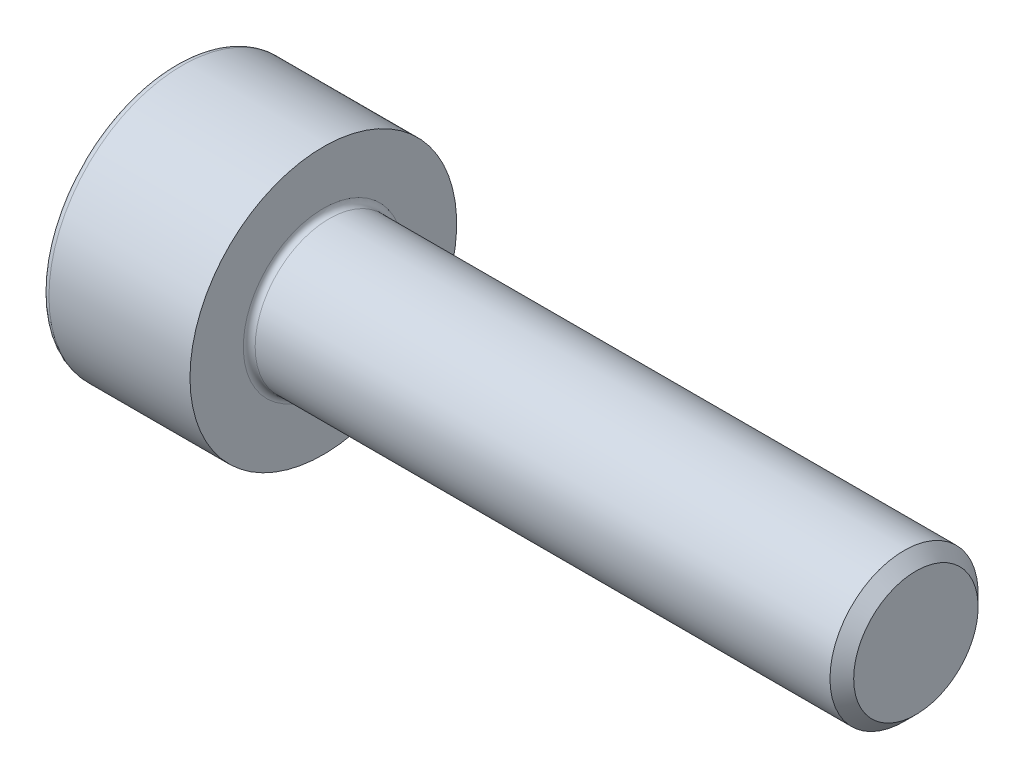
ISO-10303-21;
HEADER;
FILE_DESCRIPTION(('STEP AP214'),'2;1');
FILE_NAME('part.step','',(''),(''),'','','');
FILE_SCHEMA(('AUTOMOTIVE_DESIGN { 1 0 10303 214 1 1 1 1 }'));
ENDSEC;
DATA;
#1=APPLICATION_CONTEXT('core data for automotive mechanical design processes');
#2=APPLICATION_PROTOCOL_DEFINITION('international standard','automotive_design',2000,#1);
#3=PRODUCT_CONTEXT('',#1,'mechanical');
#4=PRODUCT('Part','Part','',(#3));
#5=PRODUCT_RELATED_PRODUCT_CATEGORY('part','',(#4));
#6=PRODUCT_DEFINITION_FORMATION('','',#4);
#7=PRODUCT_DEFINITION_CONTEXT('part definition',#1,'design');
#8=PRODUCT_DEFINITION('design','',#6,#7);
#9=PRODUCT_DEFINITION_SHAPE('','',#8);
#10=(LENGTH_UNIT() NAMED_UNIT(*) SI_UNIT(.MILLI.,.METRE.));
#11=(NAMED_UNIT(*) PLANE_ANGLE_UNIT() SI_UNIT($,.RADIAN.));
#12=(NAMED_UNIT(*) SI_UNIT($,.STERADIAN.) SOLID_ANGLE_UNIT());
#13=UNCERTAINTY_MEASURE_WITH_UNIT(LENGTH_MEASURE(1.E-05),#10,'distance_accuracy_value','');
#14=(GEOMETRIC_REPRESENTATION_CONTEXT(3) GLOBAL_UNCERTAINTY_ASSIGNED_CONTEXT((#13)) GLOBAL_UNIT_ASSIGNED_CONTEXT((#10,
#11,#12)) REPRESENTATION_CONTEXT('',''));
#15=CARTESIAN_POINT('',(0.,0.,0.));
#16=DIRECTION('',(0.,0.,1.));
#17=DIRECTION('',(1.,0.,0.));
#18=AXIS2_PLACEMENT_3D('',#15,#16,#17);
#19=CARTESIAN_POINT('',(12.5,0.,0.));
#20=DIRECTION('',(-1.,0.,0.));
#21=DIRECTION('',(0.,0.,1.));
#22=AXIS2_PLACEMENT_3D('',#19,#20,#21);
#23=PLANE('',#22);
#24=CARTESIAN_POINT('',(12.5,0.,0.));
#25=DIRECTION('',(-1.,0.,0.));
#26=DIRECTION('',(0.,0.,1.));
#27=AXIS2_PLACEMENT_3D('',#24,#25,#26);
#28=CIRCLE('',#27,1.05);
#29=CARTESIAN_POINT('',(12.5,0.,1.05));
#30=VERTEX_POINT('',#29);
#31=EDGE_CURVE('E11',#30,#30,#28,.F.);
#32=ORIENTED_EDGE('',*,*,#31,.T.);
#33=EDGE_LOOP('',(#32));
#34=FACE_BOUND('',#33,.T.);
#35=ADVANCED_FACE('F37',(#34),#23,.F.);
#36=CARTESIAN_POINT('',(0.,0.,0.));
#37=DIRECTION('',(-1.,0.,0.));
#38=DIRECTION('',(0.,0.,1.));
#39=AXIS2_PLACEMENT_3D('',#36,#37,#38);
#40=CYLINDRICAL_SURFACE('',#39,1.25);
#41=CARTESIAN_POINT('',(12.3,0.,0.));
#42=DIRECTION('',(-1.,0.,0.));
#43=DIRECTION('',(0.,0.,1.));
#44=AXIS2_PLACEMENT_3D('',#41,#42,#43);
#45=CIRCLE('',#44,1.25);
#46=CARTESIAN_POINT('',(12.3,0.,1.25));
#47=VERTEX_POINT('',#46);
#48=EDGE_CURVE('E45',#47,#47,#45,.T.);
#49=ORIENTED_EDGE('',*,*,#48,.T.);
#50=EDGE_LOOP('',(#49));
#51=FACE_BOUND('',#50,.T.);
#52=CARTESIAN_POINT('',(2.6,0.,0.));
#53=DIRECTION('',(1.,0.,0.));
#54=DIRECTION('',(0.,0.,-1.));
#55=AXIS2_PLACEMENT_3D('',#52,#53,#54);
#56=CIRCLE('',#55,1.25);
#57=CARTESIAN_POINT('',(2.6,0.,-1.25));
#58=VERTEX_POINT('',#57);
#59=EDGE_CURVE('E150',#58,#58,#56,.T.);
#60=ORIENTED_EDGE('',*,*,#59,.T.);
#61=EDGE_LOOP('',(#60));
#62=FACE_BOUND('',#61,.T.);
#63=ADVANCED_FACE('F161',(#51,#62),#40,.T.);
#64=CARTESIAN_POINT('',(2.5,0.,0.));
#65=DIRECTION('',(1.,0.,0.));
#66=DIRECTION('',(0.,0.,-1.));
#67=AXIS2_PLACEMENT_3D('',#64,#65,#66);
#68=PLANE('',#67);
#69=CARTESIAN_POINT('',(2.5,0.,0.));
#70=DIRECTION('',(1.,0.,0.));
#71=DIRECTION('',(0.,0.,-1.));
#72=AXIS2_PLACEMENT_3D('',#69,#70,#71);
#73=CIRCLE('',#72,1.35);
#74=CARTESIAN_POINT('',(2.5,0.,-1.35));
#75=VERTEX_POINT('',#74);
#76=EDGE_CURVE('E147',#75,#75,#73,.F.);
#77=ORIENTED_EDGE('',*,*,#76,.T.);
#78=EDGE_LOOP('',(#77));
#79=FACE_BOUND('',#78,.T.);
#80=CARTESIAN_POINT('',(2.5,0.,0.));
#81=DIRECTION('',(-1.,0.,0.));
#82=DIRECTION('',(0.,0.,1.));
#83=AXIS2_PLACEMENT_3D('',#80,#81,#82);
#84=CIRCLE('',#83,2.25);
#85=CARTESIAN_POINT('',(2.5,0.,2.25));
#86=VERTEX_POINT('',#85);
#87=EDGE_CURVE('E139',#86,#86,#84,.T.);
#88=ORIENTED_EDGE('',*,*,#87,.F.);
#89=EDGE_LOOP('',(#88));
#90=FACE_BOUND('',#89,.T.);
#91=ADVANCED_FACE('F183',(#79,#90),#68,.T.);
#92=CARTESIAN_POINT('',(0.,0.,0.));
#93=DIRECTION('',(-1.,0.,0.));
#94=DIRECTION('',(0.,0.,1.));
#95=AXIS2_PLACEMENT_3D('',#92,#93,#94);
#96=CYLINDRICAL_SURFACE('',#95,2.25);
#97=CARTESIAN_POINT('',(0.12,0.,0.));
#98=DIRECTION('',(-1.,0.,0.));
#99=DIRECTION('',(0.,0.,1.));
#100=AXIS2_PLACEMENT_3D('',#97,#98,#99);
#101=CIRCLE('',#100,2.25);
#102=CARTESIAN_POINT('',(0.12,0.,2.25));
#103=VERTEX_POINT('',#102);
#104=EDGE_CURVE('E156',#103,#103,#101,.F.);
#105=ORIENTED_EDGE('',*,*,#104,.T.);
#106=EDGE_LOOP('',(#105));
#107=FACE_BOUND('',#106,.T.);
#108=ORIENTED_EDGE('',*,*,#87,.T.);
#109=EDGE_LOOP('',(#108));
#110=FACE_BOUND('',#109,.T.);
#111=ADVANCED_FACE('F193',(#107,#110),#96,.T.);
#112=CARTESIAN_POINT('',(0.,0.,0.));
#113=DIRECTION('',(-1.,0.,0.));
#114=DIRECTION('',(0.,0.,1.));
#115=AXIS2_PLACEMENT_3D('',#112,#113,#114);
#116=PLANE('',#115);
#117=DIRECTION('',(0.,0.5,-0.866025403784439));
#118=VECTOR('',#117,1.);
#119=CARTESIAN_POINT('',(0.,0.577350269189626,1.));
#120=LINE('',#119,#118);
#121=CARTESIAN_POINT('',(0.,0.577350269189626,1.));
#122=VERTEX_POINT('',#121);
#123=CARTESIAN_POINT('',(0.,1.15470053837925,0.));
#124=VERTEX_POINT('',#123);
#125=EDGE_CURVE('E52',#122,#124,#120,.T.);
#126=ORIENTED_EDGE('',*,*,#125,.F.);
#127=DIRECTION('',(0.,1.,0.));
#128=VECTOR('',#127,1.);
#129=CARTESIAN_POINT('',(0.,-0.577350269189626,1.));
#130=LINE('',#129,#128);
#131=CARTESIAN_POINT('',(0.,-0.577350269189626,1.));
#132=VERTEX_POINT('',#131);
#133=EDGE_CURVE('E135',#132,#122,#130,.T.);
#134=ORIENTED_EDGE('',*,*,#133,.F.);
#135=DIRECTION('',(0.,0.5,0.866025403784439));
#136=VECTOR('',#135,1.);
#137=CARTESIAN_POINT('',(0.,-1.15470053837925,0.));
#138=LINE('',#137,#136);
#139=CARTESIAN_POINT('',(0.,-1.15470053837925,0.));
#140=VERTEX_POINT('',#139);
#141=EDGE_CURVE('E133',#140,#132,#138,.T.);
#142=ORIENTED_EDGE('',*,*,#141,.F.);
#143=DIRECTION('',(0.,-0.5,0.866025403784439));
#144=VECTOR('',#143,1.);
#145=CARTESIAN_POINT('',(0.,-0.577350269189626,-1.));
#146=LINE('',#145,#144);
#147=CARTESIAN_POINT('',(0.,-0.577350269189626,-1.));
#148=VERTEX_POINT('',#147);
#149=EDGE_CURVE('E100',#148,#140,#146,.T.);
#150=ORIENTED_EDGE('',*,*,#149,.F.);
#151=DIRECTION('',(0.,-1.,0.));
#152=VECTOR('',#151,1.);
#153=CARTESIAN_POINT('',(0.,0.577350269189626,-1.));
#154=LINE('',#153,#152);
#155=CARTESIAN_POINT('',(0.,0.577350269189626,-1.));
#156=VERTEX_POINT('',#155);
#157=EDGE_CURVE('E129',#156,#148,#154,.T.);
#158=ORIENTED_EDGE('',*,*,#157,.F.);
#159=DIRECTION('',(0.,-0.5,-0.866025403784439));
#160=VECTOR('',#159,1.);
#161=CARTESIAN_POINT('',(0.,1.15470053837925,0.));
#162=LINE('',#161,#160);
#163=EDGE_CURVE('E126',#124,#156,#162,.T.);
#164=ORIENTED_EDGE('',*,*,#163,.F.);
#165=EDGE_LOOP('',(#126,#134,#142,#150,#158,#164));
#166=FACE_BOUND('',#165,.T.);
#167=CARTESIAN_POINT('',(0.,0.,0.));
#168=DIRECTION('',(-1.,0.,0.));
#169=DIRECTION('',(0.,0.,1.));
#170=AXIS2_PLACEMENT_3D('',#167,#168,#169);
#171=CIRCLE('',#170,2.13);
#172=CARTESIAN_POINT('',(0.,0.,2.13));
#173=VERTEX_POINT('',#172);
#174=EDGE_CURVE('E153',#173,#173,#171,.T.);
#175=ORIENTED_EDGE('',*,*,#174,.T.);
#176=EDGE_LOOP('',(#175));
#177=FACE_BOUND('',#176,.T.);
#178=ADVANCED_FACE('F188',(#166,#177),#116,.T.);
#179=CARTESIAN_POINT('',(2.6,0.,0.));
#180=DIRECTION('',(1.,0.,0.));
#181=DIRECTION('',(0.,0.,-1.));
#182=AXIS2_PLACEMENT_3D('',#179,#180,#181);
#183=TOROIDAL_SURFACE('',#182,1.35,0.1);
#184=ORIENTED_EDGE('',*,*,#59,.F.);
#185=EDGE_LOOP('',(#184));
#186=FACE_BOUND('',#185,.T.);
#187=ORIENTED_EDGE('',*,*,#76,.F.);
#188=EDGE_LOOP('',(#187));
#189=FACE_BOUND('',#188,.T.);
#190=ADVANCED_FACE('F174',(#186,#189),#183,.F.);
#191=CARTESIAN_POINT('',(0.12,0.,0.));
#192=DIRECTION('',(-1.,0.,0.));
#193=DIRECTION('',(0.,0.,1.));
#194=AXIS2_PLACEMENT_3D('',#191,#192,#193);
#195=TOROIDAL_SURFACE('',#194,2.13,0.12);
#196=ORIENTED_EDGE('',*,*,#104,.F.);
#197=EDGE_LOOP('',(#196));
#198=FACE_BOUND('',#197,.T.);
#199=ORIENTED_EDGE('',*,*,#174,.F.);
#200=EDGE_LOOP('',(#199));
#201=FACE_BOUND('',#200,.T.);
#202=ADVANCED_FACE('F166',(#198,#201),#195,.T.);
#203=CARTESIAN_POINT('',(12.3,0.,0.));
#204=DIRECTION('',(-1.,0.,0.));
#205=DIRECTION('',(0.,0.,1.));
#206=AXIS2_PLACEMENT_3D('',#203,#204,#205);
#207=CONICAL_SURFACE('',#206,1.25,0.785398163397449);
#208=ORIENTED_EDGE('',*,*,#31,.F.);
#209=EDGE_LOOP('',(#208));
#210=FACE_BOUND('',#209,.T.);
#211=ORIENTED_EDGE('',*,*,#48,.F.);
#212=EDGE_LOOP('',(#211));
#213=FACE_BOUND('',#212,.T.);
#214=ADVANCED_FACE('F39',(#210,#213),#207,.T.);
#215=CARTESIAN_POINT('',(1.,0.577350269189626,1.));
#216=DIRECTION('',(0.,0.866025403784439,0.5));
#217=DIRECTION('',(0.,-0.5,0.866025403784439));
#218=AXIS2_PLACEMENT_3D('',#215,#216,#217);
#219=PLANE('',#218);
#220=ORIENTED_EDGE('',*,*,#125,.T.);
#221=DIRECTION('',(-1.,0.,0.));
#222=VECTOR('',#221,1.);
#223=CARTESIAN_POINT('',(1.,1.15470053837925,0.));
#224=LINE('',#223,#222);
#225=CARTESIAN_POINT('',(1.,1.15470053837925,0.));
#226=VERTEX_POINT('',#225);
#227=EDGE_CURVE('E82',#226,#124,#224,.T.);
#228=ORIENTED_EDGE('',*,*,#227,.F.);
#229=DIRECTION('',(0.,0.5,-0.866025403784439));
#230=VECTOR('',#229,1.);
#231=CARTESIAN_POINT('',(1.,0.577350269189626,1.));
#232=LINE('',#231,#230);
#233=CARTESIAN_POINT('',(1.,0.577350269189626,1.));
#234=VERTEX_POINT('',#233);
#235=EDGE_CURVE('E137',#234,#226,#232,.T.);
#236=ORIENTED_EDGE('',*,*,#235,.F.);
#237=DIRECTION('',(-1.,0.,0.));
#238=VECTOR('',#237,1.);
#239=CARTESIAN_POINT('',(1.,0.577350269189626,1.));
#240=LINE('',#239,#238);
#241=EDGE_CURVE('E60',#234,#122,#240,.T.);
#242=ORIENTED_EDGE('',*,*,#241,.T.);
#243=EDGE_LOOP('',(#220,#228,#236,#242));
#244=FACE_BOUND('',#243,.T.);
#245=ADVANCED_FACE('F165',(#244),#219,.F.);
#246=CARTESIAN_POINT('',(1.,-0.577350269189626,1.));
#247=DIRECTION('',(0.,0.,1.));
#248=DIRECTION('',(0.,-1.,0.));
#249=AXIS2_PLACEMENT_3D('',#246,#247,#248);
#250=PLANE('',#249);
#251=ORIENTED_EDGE('',*,*,#133,.T.);
#252=ORIENTED_EDGE('',*,*,#241,.F.);
#253=DIRECTION('',(0.,1.,0.));
#254=VECTOR('',#253,1.);
#255=CARTESIAN_POINT('',(1.,-0.577350269189626,1.));
#256=LINE('',#255,#254);
#257=CARTESIAN_POINT('',(1.,-0.577350269189626,1.));
#258=VERTEX_POINT('',#257);
#259=EDGE_CURVE('E112',#258,#234,#256,.T.);
#260=ORIENTED_EDGE('',*,*,#259,.F.);
#261=DIRECTION('',(-1.,0.,0.));
#262=VECTOR('',#261,1.);
#263=CARTESIAN_POINT('',(1.,-0.577350269189626,1.));
#264=LINE('',#263,#262);
#265=EDGE_CURVE('E104',#258,#132,#264,.T.);
#266=ORIENTED_EDGE('',*,*,#265,.T.);
#267=EDGE_LOOP('',(#251,#252,#260,#266));
#268=FACE_BOUND('',#267,.T.);
#269=ADVANCED_FACE('F172',(#268),#250,.F.);
#270=CARTESIAN_POINT('',(1.,-1.15470053837925,0.));
#271=DIRECTION('',(0.,-0.866025403784439,0.5));
#272=DIRECTION('',(0.,-0.5,-0.866025403784439));
#273=AXIS2_PLACEMENT_3D('',#270,#271,#272);
#274=PLANE('',#273);
#275=ORIENTED_EDGE('',*,*,#141,.T.);
#276=ORIENTED_EDGE('',*,*,#265,.F.);
#277=DIRECTION('',(0.,0.5,0.866025403784439));
#278=VECTOR('',#277,1.);
#279=CARTESIAN_POINT('',(1.,-1.15470053837925,0.));
#280=LINE('',#279,#278);
#281=CARTESIAN_POINT('',(1.,-1.15470053837925,0.));
#282=VERTEX_POINT('',#281);
#283=EDGE_CURVE('E108',#282,#258,#280,.T.);
#284=ORIENTED_EDGE('',*,*,#283,.F.);
#285=DIRECTION('',(-1.,0.,0.));
#286=VECTOR('',#285,1.);
#287=CARTESIAN_POINT('',(1.,-1.15470053837925,0.));
#288=LINE('',#287,#286);
#289=EDGE_CURVE('E93',#282,#140,#288,.T.);
#290=ORIENTED_EDGE('',*,*,#289,.T.);
#291=EDGE_LOOP('',(#275,#276,#284,#290));
#292=FACE_BOUND('',#291,.T.);
#293=ADVANCED_FACE('F109',(#292),#274,.F.);
#294=CARTESIAN_POINT('',(1.,-0.577350269189626,-1.));
#295=DIRECTION('',(0.,-0.866025403784439,-0.5));
#296=DIRECTION('',(0.,0.5,-0.866025403784439));
#297=AXIS2_PLACEMENT_3D('',#294,#295,#296);
#298=PLANE('',#297);
#299=ORIENTED_EDGE('',*,*,#149,.T.);
#300=ORIENTED_EDGE('',*,*,#289,.F.);
#301=DIRECTION('',(0.,-0.5,0.866025403784439));
#302=VECTOR('',#301,1.);
#303=CARTESIAN_POINT('',(1.,-0.577350269189626,-1.));
#304=LINE('',#303,#302);
#305=CARTESIAN_POINT('',(1.,-0.577350269189626,-1.));
#306=VERTEX_POINT('',#305);
#307=EDGE_CURVE('E97',#306,#282,#304,.T.);
#308=ORIENTED_EDGE('',*,*,#307,.F.);
#309=DIRECTION('',(-1.,0.,0.));
#310=VECTOR('',#309,1.);
#311=CARTESIAN_POINT('',(1.,-0.577350269189626,-1.));
#312=LINE('',#311,#310);
#313=EDGE_CURVE('E105',#306,#148,#312,.T.);
#314=ORIENTED_EDGE('',*,*,#313,.T.);
#315=EDGE_LOOP('',(#299,#300,#308,#314));
#316=FACE_BOUND('',#315,.T.);
#317=ADVANCED_FACE('F95',(#316),#298,.F.);
#318=CARTESIAN_POINT('',(1.,0.577350269189626,-1.));
#319=DIRECTION('',(0.,0.,-1.));
#320=DIRECTION('',(0.,1.,0.));
#321=AXIS2_PLACEMENT_3D('',#318,#319,#320);
#322=PLANE('',#321);
#323=ORIENTED_EDGE('',*,*,#157,.T.);
#324=ORIENTED_EDGE('',*,*,#313,.F.);
#325=DIRECTION('',(0.,-1.,0.));
#326=VECTOR('',#325,1.);
#327=CARTESIAN_POINT('',(1.,0.577350269189626,-1.));
#328=LINE('',#327,#326);
#329=CARTESIAN_POINT('',(1.,0.577350269189626,-1.));
#330=VERTEX_POINT('',#329);
#331=EDGE_CURVE('E118',#330,#306,#328,.T.);
#332=ORIENTED_EDGE('',*,*,#331,.F.);
#333=DIRECTION('',(-1.,0.,0.));
#334=VECTOR('',#333,1.);
#335=CARTESIAN_POINT('',(1.,0.577350269189626,-1.));
#336=LINE('',#335,#334);
#337=EDGE_CURVE('E142',#330,#156,#336,.T.);
#338=ORIENTED_EDGE('',*,*,#337,.T.);
#339=EDGE_LOOP('',(#323,#324,#332,#338));
#340=FACE_BOUND('',#339,.T.);
#341=ADVANCED_FACE('F213',(#340),#322,.F.);
#342=CARTESIAN_POINT('',(1.,1.15470053837925,0.));
#343=DIRECTION('',(0.,0.866025403784439,-0.5));
#344=DIRECTION('',(0.,0.5,0.866025403784439));
#345=AXIS2_PLACEMENT_3D('',#342,#343,#344);
#346=PLANE('',#345);
#347=ORIENTED_EDGE('',*,*,#163,.T.);
#348=ORIENTED_EDGE('',*,*,#337,.F.);
#349=DIRECTION('',(0.,-0.5,-0.866025403784439));
#350=VECTOR('',#349,1.);
#351=CARTESIAN_POINT('',(1.,1.15470053837925,0.));
#352=LINE('',#351,#350);
#353=EDGE_CURVE('E120',#226,#330,#352,.T.);
#354=ORIENTED_EDGE('',*,*,#353,.F.);
#355=ORIENTED_EDGE('',*,*,#227,.T.);
#356=EDGE_LOOP('',(#347,#348,#354,#355));
#357=FACE_BOUND('',#356,.T.);
#358=ADVANCED_FACE('F210',(#357),#346,.F.);
#359=CARTESIAN_POINT('',(1.,0.,0.));
#360=DIRECTION('',(-1.,0.,0.));
#361=DIRECTION('',(0.,0.,1.));
#362=AXIS2_PLACEMENT_3D('',#359,#360,#361);
#363=PLANE('',#362);
#364=ORIENTED_EDGE('',*,*,#235,.T.);
#365=ORIENTED_EDGE('',*,*,#353,.T.);
#366=ORIENTED_EDGE('',*,*,#331,.T.);
#367=ORIENTED_EDGE('',*,*,#307,.T.);
#368=ORIENTED_EDGE('',*,*,#283,.T.);
#369=ORIENTED_EDGE('',*,*,#259,.T.);
#370=EDGE_LOOP('',(#364,#365,#366,#367,#368,#369));
#371=FACE_BOUND('',#370,.T.);
#372=ADVANCED_FACE('F115',(#371),#363,.T.);
#373=CLOSED_SHELL('',(#35,#63,#91,#111,#178,#190,#202,#214,#245,#269,#293,#317,#341,#358,#372));
#374=MANIFOLD_SOLID_BREP('B2',#373);
#375=ADVANCED_BREP_SHAPE_REPRESENTATION('',(#18,#374),#14);
#376=SHAPE_DEFINITION_REPRESENTATION(#9,#375);
ENDSEC;
END-ISO-10303-21;
